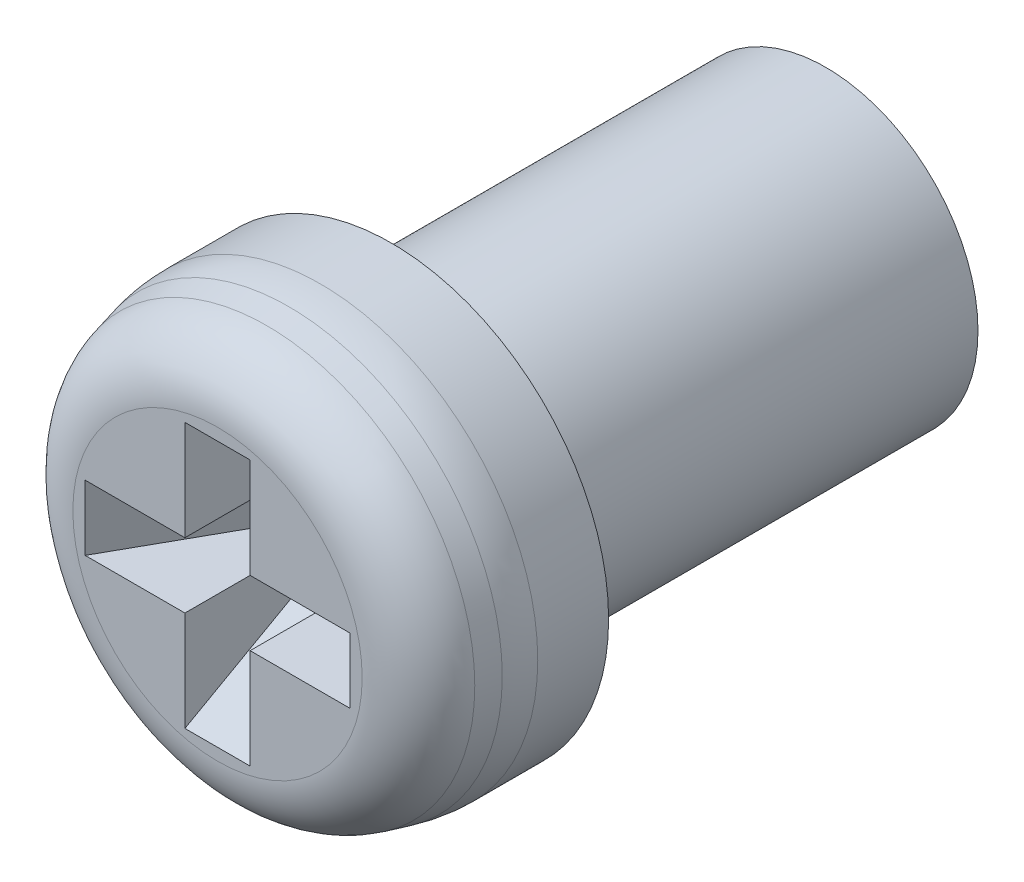
ISO-10303-21;
HEADER;
FILE_DESCRIPTION(('STEP AP214'),'2;1');
FILE_NAME('part.step','',(''),(''),'','','');
FILE_SCHEMA(('AUTOMOTIVE_DESIGN { 1 0 10303 214 1 1 1 1 }'));
ENDSEC;
DATA;
#1=APPLICATION_CONTEXT('core data for automotive mechanical design processes');
#2=APPLICATION_PROTOCOL_DEFINITION('international standard','automotive_design',2000,#1);
#3=PRODUCT_CONTEXT('',#1,'mechanical');
#4=PRODUCT('Part','Part','',(#3));
#5=PRODUCT_RELATED_PRODUCT_CATEGORY('part','',(#4));
#6=PRODUCT_DEFINITION_FORMATION('','',#4);
#7=PRODUCT_DEFINITION_CONTEXT('part definition',#1,'design');
#8=PRODUCT_DEFINITION('design','',#6,#7);
#9=PRODUCT_DEFINITION_SHAPE('','',#8);
#10=(LENGTH_UNIT() NAMED_UNIT(*) SI_UNIT(.MILLI.,.METRE.));
#11=(NAMED_UNIT(*) PLANE_ANGLE_UNIT() SI_UNIT($,.RADIAN.));
#12=(NAMED_UNIT(*) SI_UNIT($,.STERADIAN.) SOLID_ANGLE_UNIT());
#13=UNCERTAINTY_MEASURE_WITH_UNIT(LENGTH_MEASURE(1.E-05),#10,'distance_accuracy_value','');
#14=(GEOMETRIC_REPRESENTATION_CONTEXT(3) GLOBAL_UNCERTAINTY_ASSIGNED_CONTEXT((#13)) GLOBAL_UNIT_ASSIGNED_CONTEXT((#10,
#11,#12)) REPRESENTATION_CONTEXT('',''));
#15=CARTESIAN_POINT('',(0.,0.,0.));
#16=DIRECTION('',(0.,0.,1.));
#17=DIRECTION('',(1.,0.,0.));
#18=AXIS2_PLACEMENT_3D('',#15,#16,#17);
#19=CARTESIAN_POINT('',(0.,0.,14.));
#20=DIRECTION('',(0.,0.,1.));
#21=DIRECTION('',(1.,0.,0.));
#22=AXIS2_PLACEMENT_3D('',#19,#20,#21);
#23=PLANE('',#22);
#24=CARTESIAN_POINT('',(0.,0.,14.));
#25=DIRECTION('',(0.,0.,1.));
#26=DIRECTION('',(1.,0.,0.));
#27=AXIS2_PLACEMENT_3D('',#24,#25,#26);
#28=CIRCLE('',#27,3.32883539039338);
#29=CARTESIAN_POINT('',(3.32883539039338,0.,14.));
#30=VERTEX_POINT('',#29);
#31=EDGE_CURVE('E261',#30,#30,#28,.T.);
#32=ORIENTED_EDGE('',*,*,#31,.T.);
#33=EDGE_LOOP('',(#32));
#34=FACE_BOUND('',#33,.T.);
#35=DIRECTION('',(-1.,0.,0.));
#36=VECTOR('',#35,1.);
#37=CARTESIAN_POINT('',(0.75,3.05,14.));
#38=LINE('',#37,#36);
#39=CARTESIAN_POINT('',(0.75,3.05,14.));
#40=VERTEX_POINT('',#39);
#41=CARTESIAN_POINT('',(-0.75,3.05,14.));
#42=VERTEX_POINT('',#41);
#43=EDGE_CURVE('E160',#40,#42,#38,.T.);
#44=ORIENTED_EDGE('',*,*,#43,.F.);
#45=DIRECTION('',(0.,-1.,0.));
#46=VECTOR('',#45,1.);
#47=CARTESIAN_POINT('',(0.75,-3.05,14.));
#48=LINE('',#47,#46);
#49=CARTESIAN_POINT('',(0.75,0.75,14.));
#50=VERTEX_POINT('',#49);
#51=EDGE_CURVE('E183',#40,#50,#48,.T.);
#52=ORIENTED_EDGE('',*,*,#51,.T.);
#53=DIRECTION('',(1.,0.,0.));
#54=VECTOR('',#53,1.);
#55=CARTESIAN_POINT('',(3.0458983706785,0.75,14.));
#56=LINE('',#55,#54);
#57=CARTESIAN_POINT('',(3.0458983706785,0.75,14.));
#58=VERTEX_POINT('',#57);
#59=EDGE_CURVE('E239',#50,#58,#56,.T.);
#60=ORIENTED_EDGE('',*,*,#59,.T.);
#61=DIRECTION('',(0.,-1.,0.));
#62=VECTOR('',#61,1.);
#63=CARTESIAN_POINT('',(3.0458983706785,0.75,14.));
#64=LINE('',#63,#62);
#65=CARTESIAN_POINT('',(3.0458983706785,-0.75,14.));
#66=VERTEX_POINT('',#65);
#67=EDGE_CURVE('E243',#58,#66,#64,.T.);
#68=ORIENTED_EDGE('',*,*,#67,.T.);
#69=DIRECTION('',(1.,0.,0.));
#70=VECTOR('',#69,1.);
#71=CARTESIAN_POINT('',(3.0458983706785,-0.75,14.));
#72=LINE('',#71,#70);
#73=CARTESIAN_POINT('',(0.75,-0.75,14.));
#74=VERTEX_POINT('',#73);
#75=EDGE_CURVE('E225',#74,#66,#72,.T.);
#76=ORIENTED_EDGE('',*,*,#75,.F.);
#77=CARTESIAN_POINT('',(0.75,-3.05,14.));
#78=VERTEX_POINT('',#77);
#79=EDGE_CURVE('E182',#74,#78,#48,.T.);
#80=ORIENTED_EDGE('',*,*,#79,.T.);
#81=DIRECTION('',(-1.,0.,0.));
#82=VECTOR('',#81,1.);
#83=CARTESIAN_POINT('',(0.75,-3.05,14.));
#84=LINE('',#83,#82);
#85=CARTESIAN_POINT('',(-0.75,-3.05,14.));
#86=VERTEX_POINT('',#85);
#87=EDGE_CURVE('E191',#78,#86,#84,.T.);
#88=ORIENTED_EDGE('',*,*,#87,.T.);
#89=DIRECTION('',(0.,-1.,0.));
#90=VECTOR('',#89,1.);
#91=CARTESIAN_POINT('',(-0.75,-3.05,14.));
#92=LINE('',#91,#90);
#93=CARTESIAN_POINT('',(-0.75,-0.75,14.));
#94=VERTEX_POINT('',#93);
#95=EDGE_CURVE('E172',#94,#86,#92,.T.);
#96=ORIENTED_EDGE('',*,*,#95,.F.);
#97=CARTESIAN_POINT('',(-3.0458983706785,-0.75,14.));
#98=VERTEX_POINT('',#97);
#99=EDGE_CURVE('E226',#98,#94,#72,.T.);
#100=ORIENTED_EDGE('',*,*,#99,.F.);
#101=DIRECTION('',(0.,-1.,0.));
#102=VECTOR('',#101,1.);
#103=CARTESIAN_POINT('',(-3.0458983706785,0.75,14.));
#104=LINE('',#103,#102);
#105=CARTESIAN_POINT('',(-3.0458983706785,0.75,14.));
#106=VERTEX_POINT('',#105);
#107=EDGE_CURVE('E246',#106,#98,#104,.T.);
#108=ORIENTED_EDGE('',*,*,#107,.F.);
#109=CARTESIAN_POINT('',(-0.75,0.75,14.));
#110=VERTEX_POINT('',#109);
#111=EDGE_CURVE('E240',#106,#110,#56,.T.);
#112=ORIENTED_EDGE('',*,*,#111,.T.);
#113=EDGE_CURVE('E174',#42,#110,#92,.T.);
#114=ORIENTED_EDGE('',*,*,#113,.F.);
#115=EDGE_LOOP('',(#44,#52,#60,#68,#76,#80,#88,#96,#100,#108,#112,#114));
#116=FACE_BOUND('',#115,.T.);
#117=ADVANCED_FACE('F34',(#34,#116),#23,.T.);
#118=CARTESIAN_POINT('',(0.25,0.75,9.));
#119=DIRECTION('',(-0.87281107873918,0.,0.488058214591404));
#120=DIRECTION('',(0.488058214591404,0.,0.87281107873918));
#121=AXIS2_PLACEMENT_3D('',#118,#119,#120);
#122=PLANE('',#121);
#123=DIRECTION('',(-0.488058214591404,0.,-0.87281107873918));
#124=VECTOR('',#123,1.);
#125=CARTESIAN_POINT('',(0.25,0.75,9.));
#126=LINE('',#125,#124);
#127=CARTESIAN_POINT('',(0.75,0.75,9.89416697910708));
#128=VERTEX_POINT('',#127);
#129=EDGE_CURVE('E230',#58,#128,#126,.T.);
#130=ORIENTED_EDGE('',*,*,#129,.T.);
#131=DIRECTION('',(0.,-1.,0.));
#132=VECTOR('',#131,1.);
#133=CARTESIAN_POINT('',(0.75,0.75,9.89416697910708));
#134=LINE('',#133,#132);
#135=CARTESIAN_POINT('',(0.75,-0.75,9.89416697910708));
#136=VERTEX_POINT('',#135);
#137=EDGE_CURVE('E199',#128,#136,#134,.T.);
#138=ORIENTED_EDGE('',*,*,#137,.T.);
#139=DIRECTION('',(-0.488058214591404,0.,-0.87281107873918));
#140=VECTOR('',#139,1.);
#141=CARTESIAN_POINT('',(0.25,-0.75,9.));
#142=LINE('',#141,#140);
#143=EDGE_CURVE('E215',#66,#136,#142,.T.);
#144=ORIENTED_EDGE('',*,*,#143,.F.);
#145=ORIENTED_EDGE('',*,*,#67,.F.);
#146=EDGE_LOOP('',(#130,#138,#144,#145));
#147=FACE_BOUND('',#146,.T.);
#148=ADVANCED_FACE('F309',(#147),#122,.T.);
#149=CARTESIAN_POINT('',(0.,0.75,0.));
#150=DIRECTION('',(0.,-1.,0.));
#151=DIRECTION('',(0.,0.,-1.));
#152=AXIS2_PLACEMENT_3D('',#149,#150,#151);
#153=PLANE('',#152);
#154=ORIENTED_EDGE('',*,*,#59,.F.);
#155=DIRECTION('',(0.,0.,-1.));
#156=VECTOR('',#155,1.);
#157=CARTESIAN_POINT('',(0.75,0.75,0.));
#158=LINE('',#157,#156);
#159=EDGE_CURVE('E202',#50,#128,#158,.T.);
#160=ORIENTED_EDGE('',*,*,#159,.T.);
#161=ORIENTED_EDGE('',*,*,#129,.F.);
#162=EDGE_LOOP('',(#154,#160,#161));
#163=FACE_BOUND('',#162,.T.);
#164=ADVANCED_FACE('F313',(#163),#153,.T.);
#165=CARTESIAN_POINT('',(0.,-0.75,0.));
#166=DIRECTION('',(0.,-1.,0.));
#167=DIRECTION('',(0.,0.,-1.));
#168=AXIS2_PLACEMENT_3D('',#165,#166,#167);
#169=PLANE('',#168);
#170=DIRECTION('',(0.,0.,-1.));
#171=VECTOR('',#170,1.);
#172=CARTESIAN_POINT('',(0.75,-0.75,0.));
#173=LINE('',#172,#171);
#174=EDGE_CURVE('E281',#74,#136,#173,.T.);
#175=ORIENTED_EDGE('',*,*,#174,.F.);
#176=ORIENTED_EDGE('',*,*,#75,.T.);
#177=ORIENTED_EDGE('',*,*,#143,.T.);
#178=EDGE_LOOP('',(#175,#176,#177));
#179=FACE_BOUND('',#178,.T.);
#180=ADVANCED_FACE('F305',(#179),#169,.F.);
#181=CARTESIAN_POINT('',(0.,0.,10.));
#182=DIRECTION('',(0.,0.,-1.));
#183=DIRECTION('',(-1.,0.,0.));
#184=AXIS2_PLACEMENT_3D('',#181,#182,#183);
#185=CYLINDRICAL_SURFACE('',#184,3.5);
#186=CARTESIAN_POINT('',(0.,0.,9.5));
#187=DIRECTION('',(0.,0.,1.));
#188=DIRECTION('',(1.,0.,0.));
#189=AXIS2_PLACEMENT_3D('',#186,#187,#188);
#190=CIRCLE('',#189,3.5);
#191=CARTESIAN_POINT('',(3.5,0.,9.5));
#192=VERTEX_POINT('',#191);
#193=EDGE_CURVE('E276',#192,#192,#190,.F.);
#194=ORIENTED_EDGE('',*,*,#193,.T.);
#195=EDGE_LOOP('',(#194));
#196=FACE_BOUND('',#195,.T.);
#197=CARTESIAN_POINT('',(0.,0.,0.));
#198=DIRECTION('',(0.,0.,1.));
#199=DIRECTION('',(1.,0.,0.));
#200=AXIS2_PLACEMENT_3D('',#197,#198,#199);
#201=CIRCLE('',#200,3.5);
#202=CARTESIAN_POINT('',(3.5,0.,0.));
#203=VERTEX_POINT('',#202);
#204=EDGE_CURVE('E258',#203,#203,#201,.T.);
#205=ORIENTED_EDGE('',*,*,#204,.T.);
#206=EDGE_LOOP('',(#205));
#207=FACE_BOUND('',#206,.T.);
#208=ADVANCED_FACE('F337',(#196,#207),#185,.T.);
#209=CARTESIAN_POINT('',(0.,0.,0.));
#210=DIRECTION('',(0.,0.,1.));
#211=DIRECTION('',(1.,0.,0.));
#212=AXIS2_PLACEMENT_3D('',#209,#210,#211);
#213=PLANE('',#212);
#214=ORIENTED_EDGE('',*,*,#204,.F.);
#215=EDGE_LOOP('',(#214));
#216=FACE_BOUND('',#215,.T.);
#217=ADVANCED_FACE('F357',(#216),#213,.F.);
#218=CARTESIAN_POINT('',(0.,0.,14.));
#219=DIRECTION('',(0.,0.,-1.));
#220=DIRECTION('',(-1.,0.,0.));
#221=AXIS2_PLACEMENT_3D('',#218,#219,#220);
#222=CYLINDRICAL_SURFACE('',#221,5.);
#223=CARTESIAN_POINT('',(0.,0.,11.630683123147));
#224=DIRECTION('',(0.,0.,1.));
#225=DIRECTION('',(1.,0.,0.));
#226=AXIS2_PLACEMENT_3D('',#223,#224,#225);
#227=CIRCLE('',#226,5.);
#228=CARTESIAN_POINT('',(5.,0.,11.630683123147));
#229=VERTEX_POINT('',#228);
#230=EDGE_CURVE('E267',#229,#229,#227,.F.);
#231=ORIENTED_EDGE('',*,*,#230,.T.);
#232=EDGE_LOOP('',(#231));
#233=FACE_BOUND('',#232,.T.);
#234=CARTESIAN_POINT('',(0.,0.,10.));
#235=DIRECTION('',(0.,0.,1.));
#236=DIRECTION('',(1.,0.,0.));
#237=AXIS2_PLACEMENT_3D('',#234,#235,#236);
#238=CIRCLE('',#237,5.);
#239=CARTESIAN_POINT('',(5.,0.,10.));
#240=VERTEX_POINT('',#239);
#241=EDGE_CURVE('E255',#240,#240,#238,.T.);
#242=ORIENTED_EDGE('',*,*,#241,.T.);
#243=EDGE_LOOP('',(#242));
#244=FACE_BOUND('',#243,.T.);
#245=ADVANCED_FACE('F353',(#233,#244),#222,.T.);
#246=CARTESIAN_POINT('',(0.,0.,10.));
#247=DIRECTION('',(0.,0.,1.));
#248=DIRECTION('',(1.,0.,0.));
#249=AXIS2_PLACEMENT_3D('',#246,#247,#248);
#250=PLANE('',#249);
#251=CARTESIAN_POINT('',(0.,0.,10.));
#252=DIRECTION('',(0.,0.,1.));
#253=DIRECTION('',(1.,0.,0.));
#254=AXIS2_PLACEMENT_3D('',#251,#252,#253);
#255=CIRCLE('',#254,4.);
#256=CARTESIAN_POINT('',(4.,0.,10.));
#257=VERTEX_POINT('',#256);
#258=EDGE_CURVE('E273',#257,#257,#255,.T.);
#259=ORIENTED_EDGE('',*,*,#258,.T.);
#260=EDGE_LOOP('',(#259));
#261=FACE_BOUND('',#260,.T.);
#262=ORIENTED_EDGE('',*,*,#241,.F.);
#263=EDGE_LOOP('',(#262));
#264=FACE_BOUND('',#263,.T.);
#265=ADVANCED_FACE('F349',(#261,#264),#250,.F.);
#266=CARTESIAN_POINT('',(0.,0.,14.));
#267=DIRECTION('',(0.,0.,-1.));
#268=DIRECTION('',(-1.,0.,0.));
#269=AXIS2_PLACEMENT_3D('',#266,#267,#268);
#270=CONICAL_SURFACE('',#269,4.5,0.244978663126861);
#271=CARTESIAN_POINT('',(0.,0.,12.358289998256));
#272=DIRECTION('',(0.,0.,-1.));
#273=DIRECTION('',(-1.,0.,0.));
#274=AXIS2_PLACEMENT_3D('',#271,#272,#273);
#275=CIRCLE('',#274,4.910427500436);
#276=CARTESIAN_POINT('',(-4.910427500436,0.,12.358289998256));
#277=VERTEX_POINT('',#276);
#278=EDGE_CURVE('E270',#277,#277,#275,.F.);
#279=ORIENTED_EDGE('',*,*,#278,.T.);
#280=EDGE_LOOP('',(#279));
#281=FACE_BOUND('',#280,.T.);
#282=CARTESIAN_POINT('',(0.,0.,12.8638034375545));
#283=DIRECTION('',(0.,0.,1.));
#284=DIRECTION('',(1.,0.,0.));
#285=AXIS2_PLACEMENT_3D('',#282,#283,#284);
#286=CIRCLE('',#285,4.78404914061138);
#287=CARTESIAN_POINT('',(4.78404914061138,0.,12.8638034375545));
#288=VERTEX_POINT('',#287);
#289=EDGE_CURVE('E264',#288,#288,#286,.F.);
#290=ORIENTED_EDGE('',*,*,#289,.T.);
#291=EDGE_LOOP('',(#290));
#292=FACE_BOUND('',#291,.T.);
#293=ADVANCED_FACE('F352',(#281,#292),#270,.T.);
#294=CARTESIAN_POINT('',(0.,0.,12.5));
#295=DIRECTION('',(0.,0.,1.));
#296=DIRECTION('',(1.,0.,0.));
#297=AXIS2_PLACEMENT_3D('',#294,#295,#296);
#298=TOROIDAL_SURFACE('',#297,3.32883539039338,1.5);
#299=ORIENTED_EDGE('',*,*,#289,.F.);
#300=EDGE_LOOP('',(#299));
#301=FACE_BOUND('',#300,.T.);
#302=ORIENTED_EDGE('',*,*,#31,.F.);
#303=EDGE_LOOP('',(#302));
#304=FACE_BOUND('',#303,.T.);
#305=ADVANCED_FACE('F367',(#301,#304),#298,.T.);
#306=CARTESIAN_POINT('',(0.,0.,11.630683123147));
#307=DIRECTION('',(0.,0.,1.));
#308=DIRECTION('',(1.,0.,0.));
#309=AXIS2_PLACEMENT_3D('',#306,#307,#308);
#310=DEGENERATE_TOROIDAL_SURFACE('',#309,2.,3.,.T.);
#311=ORIENTED_EDGE('',*,*,#278,.F.);
#312=EDGE_LOOP('',(#311));
#313=FACE_BOUND('',#312,.T.);
#314=ORIENTED_EDGE('',*,*,#230,.F.);
#315=EDGE_LOOP('',(#314));
#316=FACE_BOUND('',#315,.T.);
#317=ADVANCED_FACE('F370',(#313,#316),#310,.T.);
#318=CARTESIAN_POINT('',(0.,0.,9.5));
#319=DIRECTION('',(0.,0.,1.));
#320=DIRECTION('',(1.,0.,0.));
#321=AXIS2_PLACEMENT_3D('',#318,#319,#320);
#322=TOROIDAL_SURFACE('',#321,4.,0.5);
#323=ORIENTED_EDGE('',*,*,#193,.F.);
#324=EDGE_LOOP('',(#323));
#325=FACE_BOUND('',#324,.T.);
#326=ORIENTED_EDGE('',*,*,#258,.F.);
#327=EDGE_LOOP('',(#326));
#328=FACE_BOUND('',#327,.T.);
#329=ADVANCED_FACE('F36',(#325,#328),#322,.F.);
#330=CARTESIAN_POINT('',(-3.0458983706785,0.75,14.));
#331=DIRECTION('',(0.87281107873918,0.,0.488058214591404));
#332=DIRECTION('',(0.488058214591404,0.,-0.87281107873918));
#333=AXIS2_PLACEMENT_3D('',#330,#331,#332);
#334=PLANE('',#333);
#335=DIRECTION('',(0.,-1.,0.));
#336=VECTOR('',#335,1.);
#337=CARTESIAN_POINT('',(-0.75,0.75,9.89416697910708));
#338=LINE('',#337,#336);
#339=CARTESIAN_POINT('',(-0.75,0.75,9.89416697910708));
#340=VERTEX_POINT('',#339);
#341=CARTESIAN_POINT('',(-0.750000000000001,-0.75,9.89416697910708));
#342=VERTEX_POINT('',#341);
#343=EDGE_CURVE('E49',#340,#342,#338,.T.);
#344=ORIENTED_EDGE('',*,*,#343,.F.);
#345=DIRECTION('',(-0.488058214591404,0.,0.87281107873918));
#346=VECTOR('',#345,1.);
#347=CARTESIAN_POINT('',(-3.0458983706785,0.75,14.));
#348=LINE('',#347,#346);
#349=EDGE_CURVE('E235',#340,#106,#348,.T.);
#350=ORIENTED_EDGE('',*,*,#349,.T.);
#351=ORIENTED_EDGE('',*,*,#107,.T.);
#352=DIRECTION('',(-0.488058214591404,0.,0.87281107873918));
#353=VECTOR('',#352,1.);
#354=CARTESIAN_POINT('',(-3.0458983706785,-0.75,14.));
#355=LINE('',#354,#353);
#356=EDGE_CURVE('E221',#342,#98,#355,.T.);
#357=ORIENTED_EDGE('',*,*,#356,.F.);
#358=EDGE_LOOP('',(#344,#350,#351,#357));
#359=FACE_BOUND('',#358,.T.);
#360=ADVANCED_FACE('F322',(#359),#334,.T.);
#361=DIRECTION('',(0.,0.,-1.));
#362=VECTOR('',#361,1.);
#363=CARTESIAN_POINT('',(-0.75,0.75,0.));
#364=LINE('',#363,#362);
#365=EDGE_CURVE('E197',#110,#340,#364,.T.);
#366=ORIENTED_EDGE('',*,*,#365,.F.);
#367=ORIENTED_EDGE('',*,*,#111,.F.);
#368=ORIENTED_EDGE('',*,*,#349,.F.);
#369=EDGE_LOOP('',(#366,#367,#368));
#370=FACE_BOUND('',#369,.T.);
#371=ADVANCED_FACE('F320',(#370),#153,.T.);
#372=ORIENTED_EDGE('',*,*,#99,.T.);
#373=DIRECTION('',(0.,0.,-1.));
#374=VECTOR('',#373,1.);
#375=CARTESIAN_POINT('',(-0.75,-0.75,0.));
#376=LINE('',#375,#374);
#377=EDGE_CURVE('E279',#94,#342,#376,.T.);
#378=ORIENTED_EDGE('',*,*,#377,.T.);
#379=ORIENTED_EDGE('',*,*,#356,.T.);
#380=EDGE_LOOP('',(#372,#378,#379));
#381=FACE_BOUND('',#380,.T.);
#382=ADVANCED_FACE('F325',(#381),#169,.F.);
#383=CARTESIAN_POINT('',(0.75,3.05,14.));
#384=DIRECTION('',(0.,-0.87250601594972,0.488603368931843));
#385=DIRECTION('',(0.,-0.488603368931843,-0.87250601594972));
#386=AXIS2_PLACEMENT_3D('',#383,#384,#385);
#387=PLANE('',#386);
#388=DIRECTION('',(-1.,0.,0.));
#389=VECTOR('',#388,1.);
#390=CARTESIAN_POINT('',(0.75,0.25,9.));
#391=LINE('',#390,#389);
#392=CARTESIAN_POINT('',(0.75,0.25,9.));
#393=VERTEX_POINT('',#392);
#394=CARTESIAN_POINT('',(0.25,0.25,9.));
#395=VERTEX_POINT('',#394);
#396=EDGE_CURVE('E159',#393,#395,#391,.T.);
#397=ORIENTED_EDGE('',*,*,#396,.F.);
#398=DIRECTION('',(0.,0.488603368931843,0.87250601594972));
#399=VECTOR('',#398,1.);
#400=CARTESIAN_POINT('',(0.75,3.05,14.));
#401=LINE('',#400,#399);
#402=EDGE_CURVE('E180',#393,#40,#401,.T.);
#403=ORIENTED_EDGE('',*,*,#402,.T.);
#404=ORIENTED_EDGE('',*,*,#43,.T.);
#405=DIRECTION('',(0.,0.488603368931843,0.87250601594972));
#406=VECTOR('',#405,1.);
#407=CARTESIAN_POINT('',(-0.75,3.05,14.));
#408=LINE('',#407,#406);
#409=CARTESIAN_POINT('',(-0.75,0.25,9.));
#410=VERTEX_POINT('',#409);
#411=EDGE_CURVE('E164',#410,#42,#408,.T.);
#412=ORIENTED_EDGE('',*,*,#411,.F.);
#413=CARTESIAN_POINT('',(-0.25,0.25,9.));
#414=VERTEX_POINT('',#413);
#415=EDGE_CURVE('E147',#414,#410,#391,.T.);
#416=ORIENTED_EDGE('',*,*,#415,.F.);
#417=DIRECTION('',(0.438483707712004,-0.439126970590015,-0.784155304625028));
#418=VECTOR('',#417,1.);
#419=CARTESIAN_POINT('',(-2.60303331957101,2.606485258511,13.2080093901982));
#420=LINE('',#419,#418);
#421=CARTESIAN_POINT('',(-0.749267566192589,0.75,9.89285714285714));
#422=VERTEX_POINT('',#421);
#423=EDGE_CURVE('E209',#422,#414,#420,.T.);
#424=ORIENTED_EDGE('',*,*,#423,.F.);
#425=DIRECTION('',(-1.,0.,0.));
#426=VECTOR('',#425,1.);
#427=CARTESIAN_POINT('',(0.,0.75,9.89285714285714));
#428=LINE('',#427,#426);
#429=CARTESIAN_POINT('',(0.74926756619259,0.75,9.89285714285714));
#430=VERTEX_POINT('',#429);
#431=EDGE_CURVE('E11',#430,#422,#428,.T.);
#432=ORIENTED_EDGE('',*,*,#431,.F.);
#433=DIRECTION('',(0.438483707712004,0.439126970590016,0.784155304625028));
#434=VECTOR('',#433,1.);
#435=CARTESIAN_POINT('',(0.346275011110325,0.346416248149782,9.17217187169604));
#436=LINE('',#435,#434);
#437=EDGE_CURVE('E211',#395,#430,#436,.T.);
#438=ORIENTED_EDGE('',*,*,#437,.F.);
#439=EDGE_LOOP('',(#397,#403,#404,#412,#416,#424,#432,#438));
#440=FACE_BOUND('',#439,.T.);
#441=ADVANCED_FACE('F170',(#440),#387,.T.);
#442=CARTESIAN_POINT('',(0.75,-0.25,9.));
#443=DIRECTION('',(0.,0.87250601594972,0.488603368931843));
#444=DIRECTION('',(0.,-0.488603368931843,0.87250601594972));
#445=AXIS2_PLACEMENT_3D('',#442,#443,#444);
#446=PLANE('',#445);
#447=DIRECTION('',(-1.,0.,0.));
#448=VECTOR('',#447,1.);
#449=CARTESIAN_POINT('',(0.,-0.75,9.89285714285714));
#450=LINE('',#449,#448);
#451=CARTESIAN_POINT('',(0.749267566192589,-0.75,9.89285714285714));
#452=VERTEX_POINT('',#451);
#453=CARTESIAN_POINT('',(-0.749267566192589,-0.75,9.89285714285714));
#454=VERTEX_POINT('',#453);
#455=EDGE_CURVE('E42',#452,#454,#450,.T.);
#456=ORIENTED_EDGE('',*,*,#455,.T.);
#457=DIRECTION('',(-0.438483707712004,-0.439126970590015,0.784155304625028));
#458=VECTOR('',#457,1.);
#459=CARTESIAN_POINT('',(-2.31420828624003,-2.31723651406166,12.6914937751101));
#460=LINE('',#459,#458);
#461=CARTESIAN_POINT('',(-0.250000000000001,-0.250000000000001,9.));
#462=VERTEX_POINT('',#461);
#463=EDGE_CURVE('E205',#462,#454,#460,.T.);
#464=ORIENTED_EDGE('',*,*,#463,.F.);
#465=DIRECTION('',(-1.,0.,0.));
#466=VECTOR('',#465,1.);
#467=CARTESIAN_POINT('',(0.75,-0.25,9.));
#468=LINE('',#467,#466);
#469=CARTESIAN_POINT('',(-0.75,-0.25,9.));
#470=VERTEX_POINT('',#469);
#471=EDGE_CURVE('E188',#462,#470,#468,.T.);
#472=ORIENTED_EDGE('',*,*,#471,.T.);
#473=DIRECTION('',(0.,0.488603368931843,-0.87250601594972));
#474=VECTOR('',#473,1.);
#475=CARTESIAN_POINT('',(-0.75,-0.25,9.));
#476=LINE('',#475,#474);
#477=EDGE_CURVE('E167',#86,#470,#476,.T.);
#478=ORIENTED_EDGE('',*,*,#477,.F.);
#479=ORIENTED_EDGE('',*,*,#87,.F.);
#480=DIRECTION('',(0.,0.488603368931843,-0.87250601594972));
#481=VECTOR('',#480,1.);
#482=CARTESIAN_POINT('',(0.75,-0.25,9.));
#483=LINE('',#482,#481);
#484=CARTESIAN_POINT('',(0.75,-0.25,9.));
#485=VERTEX_POINT('',#484);
#486=EDGE_CURVE('E186',#78,#485,#483,.T.);
#487=ORIENTED_EDGE('',*,*,#486,.T.);
#488=CARTESIAN_POINT('',(0.25,-0.25,9.));
#489=VERTEX_POINT('',#488);
#490=EDGE_CURVE('E189',#485,#489,#468,.T.);
#491=ORIENTED_EDGE('',*,*,#490,.T.);
#492=DIRECTION('',(-0.438483707712004,0.439126970590015,-0.784155304625028));
#493=VECTOR('',#492,1.);
#494=CARTESIAN_POINT('',(0.0574499777793499,-0.0571675037004359,8.65565625660792));
#495=LINE('',#494,#493);
#496=EDGE_CURVE('E57',#452,#489,#495,.T.);
#497=ORIENTED_EDGE('',*,*,#496,.F.);
#498=EDGE_LOOP('',(#456,#464,#472,#478,#479,#487,#491,#497));
#499=FACE_BOUND('',#498,.T.);
#500=ADVANCED_FACE('F282',(#499),#446,.T.);
#501=CARTESIAN_POINT('',(0.75,0.,0.));
#502=DIRECTION('',(-1.,0.,0.));
#503=DIRECTION('',(0.,0.,1.));
#504=AXIS2_PLACEMENT_3D('',#501,#502,#503);
#505=PLANE('',#504);
#506=ORIENTED_EDGE('',*,*,#51,.F.);
#507=ORIENTED_EDGE('',*,*,#402,.F.);
#508=DIRECTION('',(0.,1.,0.));
#509=VECTOR('',#508,1.);
#510=CARTESIAN_POINT('',(0.75,0.,9.));
#511=LINE('',#510,#509);
#512=EDGE_CURVE('E178',#485,#393,#511,.T.);
#513=ORIENTED_EDGE('',*,*,#512,.F.);
#514=ORIENTED_EDGE('',*,*,#486,.F.);
#515=ORIENTED_EDGE('',*,*,#79,.F.);
#516=ORIENTED_EDGE('',*,*,#174,.T.);
#517=ORIENTED_EDGE('',*,*,#137,.F.);
#518=ORIENTED_EDGE('',*,*,#159,.F.);
#519=EDGE_LOOP('',(#506,#507,#513,#514,#515,#516,#517,#518));
#520=FACE_BOUND('',#519,.T.);
#521=ADVANCED_FACE('F302',(#520),#505,.T.);
#522=CARTESIAN_POINT('',(-0.75,0.,0.));
#523=DIRECTION('',(-1.,0.,0.));
#524=DIRECTION('',(0.,0.,1.));
#525=AXIS2_PLACEMENT_3D('',#522,#523,#524);
#526=PLANE('',#525);
#527=ORIENTED_EDGE('',*,*,#365,.T.);
#528=ORIENTED_EDGE('',*,*,#343,.T.);
#529=ORIENTED_EDGE('',*,*,#377,.F.);
#530=ORIENTED_EDGE('',*,*,#95,.T.);
#531=ORIENTED_EDGE('',*,*,#477,.T.);
#532=DIRECTION('',(0.,1.,0.));
#533=VECTOR('',#532,1.);
#534=CARTESIAN_POINT('',(-0.75,0.,9.));
#535=LINE('',#534,#533);
#536=EDGE_CURVE('E152',#470,#410,#535,.T.);
#537=ORIENTED_EDGE('',*,*,#536,.T.);
#538=ORIENTED_EDGE('',*,*,#411,.T.);
#539=ORIENTED_EDGE('',*,*,#113,.T.);
#540=EDGE_LOOP('',(#527,#528,#529,#530,#531,#537,#538,#539));
#541=FACE_BOUND('',#540,.T.);
#542=ADVANCED_FACE('F163',(#541),#526,.F.);
#543=CARTESIAN_POINT('',(0.,0.75,9.));
#544=DIRECTION('',(0.,0.,1.));
#545=DIRECTION('',(1.,0.,0.));
#546=AXIS2_PLACEMENT_3D('',#543,#544,#545);
#547=PLANE('',#546);
#548=DIRECTION('',(0.,-1.,0.));
#549=VECTOR('',#548,1.);
#550=CARTESIAN_POINT('',(0.25,0.75,9.));
#551=LINE('',#550,#549);
#552=CARTESIAN_POINT('',(0.25,-0.75,9.));
#553=VERTEX_POINT('',#552);
#554=EDGE_CURVE('E251',#489,#553,#551,.T.);
#555=ORIENTED_EDGE('',*,*,#554,.F.);
#556=ORIENTED_EDGE('',*,*,#490,.F.);
#557=ORIENTED_EDGE('',*,*,#512,.T.);
#558=ORIENTED_EDGE('',*,*,#396,.T.);
#559=CARTESIAN_POINT('',(0.25,0.75,9.));
#560=VERTEX_POINT('',#559);
#561=EDGE_CURVE('E252',#560,#395,#551,.T.);
#562=ORIENTED_EDGE('',*,*,#561,.F.);
#563=DIRECTION('',(-1.,0.,0.));
#564=VECTOR('',#563,1.);
#565=CARTESIAN_POINT('',(0.,0.75,9.));
#566=LINE('',#565,#564);
#567=CARTESIAN_POINT('',(-0.25,0.75,9.));
#568=VERTEX_POINT('',#567);
#569=EDGE_CURVE('E233',#560,#568,#566,.T.);
#570=ORIENTED_EDGE('',*,*,#569,.T.);
#571=DIRECTION('',(0.,-1.,0.));
#572=VECTOR('',#571,1.);
#573=CARTESIAN_POINT('',(-0.25,0.75,9.));
#574=LINE('',#573,#572);
#575=EDGE_CURVE('E155',#568,#414,#574,.T.);
#576=ORIENTED_EDGE('',*,*,#575,.T.);
#577=ORIENTED_EDGE('',*,*,#415,.T.);
#578=ORIENTED_EDGE('',*,*,#536,.F.);
#579=ORIENTED_EDGE('',*,*,#471,.F.);
#580=CARTESIAN_POINT('',(-0.25,-0.75,9.));
#581=VERTEX_POINT('',#580);
#582=EDGE_CURVE('E249',#462,#581,#574,.T.);
#583=ORIENTED_EDGE('',*,*,#582,.T.);
#584=DIRECTION('',(-1.,0.,0.));
#585=VECTOR('',#584,1.);
#586=CARTESIAN_POINT('',(0.,-0.75,9.));
#587=LINE('',#586,#585);
#588=EDGE_CURVE('E218',#553,#581,#587,.T.);
#589=ORIENTED_EDGE('',*,*,#588,.F.);
#590=EDGE_LOOP('',(#555,#556,#557,#558,#562,#570,#576,#577,#578,#579,#583,#589));
#591=FACE_BOUND('',#590,.T.);
#592=ADVANCED_FACE('F150',(#591),#547,.T.);
#593=ORIENTED_EDGE('',*,*,#455,.F.);
#594=EDGE_CURVE('E214',#452,#553,#142,.T.);
#595=ORIENTED_EDGE('',*,*,#594,.T.);
#596=ORIENTED_EDGE('',*,*,#588,.T.);
#597=EDGE_CURVE('E222',#581,#454,#355,.T.);
#598=ORIENTED_EDGE('',*,*,#597,.T.);
#599=EDGE_LOOP('',(#593,#595,#596,#598));
#600=FACE_BOUND('',#599,.T.);
#601=ADVANCED_FACE('F290',(#600),#169,.F.);
#602=ORIENTED_EDGE('',*,*,#582,.F.);
#603=ORIENTED_EDGE('',*,*,#463,.T.);
#604=ORIENTED_EDGE('',*,*,#597,.F.);
#605=EDGE_LOOP('',(#602,#603,#604));
#606=FACE_BOUND('',#605,.T.);
#607=ADVANCED_FACE('F289',(#606),#334,.T.);
#608=ORIENTED_EDGE('',*,*,#594,.F.);
#609=ORIENTED_EDGE('',*,*,#496,.T.);
#610=ORIENTED_EDGE('',*,*,#554,.T.);
#611=EDGE_LOOP('',(#608,#609,#610));
#612=FACE_BOUND('',#611,.T.);
#613=ADVANCED_FACE('F346',(#612),#122,.T.);
#614=EDGE_CURVE('E229',#430,#560,#126,.T.);
#615=ORIENTED_EDGE('',*,*,#614,.F.);
#616=ORIENTED_EDGE('',*,*,#431,.T.);
#617=EDGE_CURVE('E236',#568,#422,#348,.T.);
#618=ORIENTED_EDGE('',*,*,#617,.F.);
#619=ORIENTED_EDGE('',*,*,#569,.F.);
#620=EDGE_LOOP('',(#615,#616,#618,#619));
#621=FACE_BOUND('',#620,.T.);
#622=ADVANCED_FACE('F334',(#621),#153,.T.);
#623=ORIENTED_EDGE('',*,*,#617,.T.);
#624=ORIENTED_EDGE('',*,*,#423,.T.);
#625=ORIENTED_EDGE('',*,*,#575,.F.);
#626=EDGE_LOOP('',(#623,#624,#625));
#627=FACE_BOUND('',#626,.T.);
#628=ADVANCED_FACE('F392',(#627),#334,.T.);
#629=ORIENTED_EDGE('',*,*,#561,.T.);
#630=ORIENTED_EDGE('',*,*,#437,.T.);
#631=ORIENTED_EDGE('',*,*,#614,.T.);
#632=EDGE_LOOP('',(#629,#630,#631));
#633=FACE_BOUND('',#632,.T.);
#634=ADVANCED_FACE('F345',(#633),#122,.T.);
#635=CLOSED_SHELL('',(#117,#148,#164,#180,#208,#217,#245,#265,#293,#305,#317,#329,#360,#371,
#382,#441,#500,#521,#542,#592,#601,#607,#613,#622,#628,#634));
#636=MANIFOLD_SOLID_BREP('B2',#635);
#637=ADVANCED_BREP_SHAPE_REPRESENTATION('',(#18,#636),#14);
#638=SHAPE_DEFINITION_REPRESENTATION(#9,#637);
ENDSEC;
END-ISO-10303-21;
